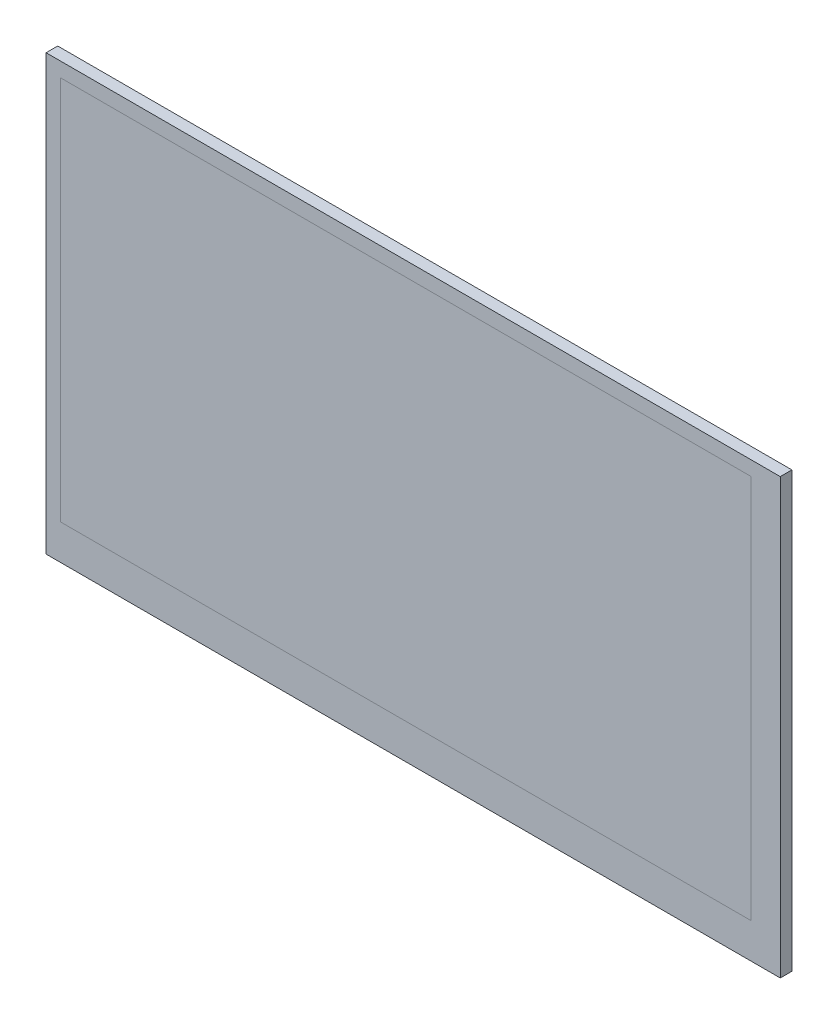
ISO-10303-21;
HEADER;
FILE_DESCRIPTION(('STEP AP214'),'2;1');
FILE_NAME('part.step','',(''),(''),'','','');
FILE_SCHEMA(('AUTOMOTIVE_DESIGN { 1 0 10303 214 1 1 1 1 }'));
ENDSEC;
DATA;
#1=APPLICATION_CONTEXT('core data for automotive mechanical design processes');
#2=APPLICATION_PROTOCOL_DEFINITION('international standard','automotive_design',2000,#1);
#3=PRODUCT_CONTEXT('',#1,'mechanical');
#4=PRODUCT('Part','Part','',(#3));
#5=PRODUCT_RELATED_PRODUCT_CATEGORY('part','',(#4));
#6=PRODUCT_DEFINITION_FORMATION('','',#4);
#7=PRODUCT_DEFINITION_CONTEXT('part definition',#1,'design');
#8=PRODUCT_DEFINITION('design','',#6,#7);
#9=PRODUCT_DEFINITION_SHAPE('','',#8);
#10=(LENGTH_UNIT() NAMED_UNIT(*) SI_UNIT(.MILLI.,.METRE.));
#11=(NAMED_UNIT(*) PLANE_ANGLE_UNIT() SI_UNIT($,.RADIAN.));
#12=(NAMED_UNIT(*) SI_UNIT($,.STERADIAN.) SOLID_ANGLE_UNIT());
#13=UNCERTAINTY_MEASURE_WITH_UNIT(LENGTH_MEASURE(1.E-05),#10,'distance_accuracy_value','');
#14=(GEOMETRIC_REPRESENTATION_CONTEXT(3) GLOBAL_UNCERTAINTY_ASSIGNED_CONTEXT((#13)) GLOBAL_UNIT_ASSIGNED_CONTEXT((#10,
#11,#12)) REPRESENTATION_CONTEXT('',''));
#15=CARTESIAN_POINT('',(0.,0.,0.));
#16=DIRECTION('',(0.,0.,1.));
#17=DIRECTION('',(1.,0.,0.));
#18=AXIS2_PLACEMENT_3D('',#15,#16,#17);
#19=CARTESIAN_POINT('',(0.,0.,1.6));
#20=DIRECTION('',(0.,0.,1.));
#21=DIRECTION('',(1.,0.,0.));
#22=AXIS2_PLACEMENT_3D('',#19,#20,#21);
#23=PLANE('',#22);
#24=DIRECTION('',(0.,-1.,0.));
#25=VECTOR('',#24,1.);
#26=CARTESIAN_POINT('',(-78.8000000000001,45.26,1.6));
#27=LINE('',#26,#25);
#28=CARTESIAN_POINT('',(-78.8000000000001,45.26,1.6));
#29=VERTEX_POINT('',#28);
#30=CARTESIAN_POINT('',(-78.8000000000001,-40.66,1.6));
#31=VERTEX_POINT('',#30);
#32=EDGE_CURVE('E97',#29,#31,#27,.T.);
#33=ORIENTED_EDGE('',*,*,#32,.F.);
#34=DIRECTION('',(-1.,0.,0.));
#35=VECTOR('',#34,1.);
#36=CARTESIAN_POINT('',(-78.8000000000001,45.26,1.6));
#37=LINE('',#36,#35);
#38=CARTESIAN_POINT('',(75.41,45.26,1.6));
#39=VERTEX_POINT('',#38);
#40=EDGE_CURVE('E114',#39,#29,#37,.T.);
#41=ORIENTED_EDGE('',*,*,#40,.F.);
#42=DIRECTION('',(0.,1.,0.));
#43=VECTOR('',#42,1.);
#44=CARTESIAN_POINT('',(75.41,45.26,1.6));
#45=LINE('',#44,#43);
#46=CARTESIAN_POINT('',(75.41,-40.66,1.6));
#47=VERTEX_POINT('',#46);
#48=EDGE_CURVE('E99',#47,#39,#45,.T.);
#49=ORIENTED_EDGE('',*,*,#48,.F.);
#50=DIRECTION('',(1.,0.,0.));
#51=VECTOR('',#50,1.);
#52=CARTESIAN_POINT('',(-78.8000000000001,-40.66,1.6));
#53=LINE('',#52,#51);
#54=EDGE_CURVE('E96',#31,#47,#53,.T.);
#55=ORIENTED_EDGE('',*,*,#54,.F.);
#56=EDGE_LOOP('',(#33,#41,#49,#55));
#57=FACE_BOUND('',#56,.T.);
#58=ADVANCED_FACE('F52',(#57),#23,.F.);
#59=CARTESIAN_POINT('',(-78.8000000000001,45.26,-0.00199999999999983));
#60=DIRECTION('',(0.,1.,0.));
#61=DIRECTION('',(0.,0.,1.));
#62=AXIS2_PLACEMENT_3D('',#59,#60,#61);
#63=PLANE('',#62);
#64=DIRECTION('',(0.,0.,1.));
#65=VECTOR('',#64,1.);
#66=CARTESIAN_POINT('',(75.41,45.26,-0.00199999999999983));
#67=LINE('',#66,#65);
#68=CARTESIAN_POINT('',(75.41,45.26,2.6));
#69=VERTEX_POINT('',#68);
#70=EDGE_CURVE('E80',#39,#69,#67,.T.);
#71=ORIENTED_EDGE('',*,*,#70,.F.);
#72=ORIENTED_EDGE('',*,*,#40,.T.);
#73=DIRECTION('',(0.,0.,1.));
#74=VECTOR('',#73,1.);
#75=CARTESIAN_POINT('',(-78.8000000000001,45.26,-0.00199999999999983));
#76=LINE('',#75,#74);
#77=CARTESIAN_POINT('',(-78.8000000000001,45.26,2.6));
#78=VERTEX_POINT('',#77);
#79=EDGE_CURVE('E60',#29,#78,#76,.T.);
#80=ORIENTED_EDGE('',*,*,#79,.T.);
#81=DIRECTION('',(-1.,0.,0.));
#82=VECTOR('',#81,1.);
#83=CARTESIAN_POINT('',(-78.8000000000001,45.26,2.6));
#84=LINE('',#83,#82);
#85=EDGE_CURVE('E119',#69,#78,#84,.T.);
#86=ORIENTED_EDGE('',*,*,#85,.F.);
#87=EDGE_LOOP('',(#71,#72,#80,#86));
#88=FACE_BOUND('',#87,.T.);
#89=ADVANCED_FACE('F127',(#88),#63,.T.);
#90=CARTESIAN_POINT('',(0.,0.,2.6));
#91=DIRECTION('',(0.,0.,1.));
#92=DIRECTION('',(1.,0.,0.));
#93=AXIS2_PLACEMENT_3D('',#90,#91,#92);
#94=PLANE('',#93);
#95=DIRECTION('',(0.,-1.,0.));
#96=VECTOR('',#95,1.);
#97=CARTESIAN_POINT('',(-78.8000000000001,45.26,2.6));
#98=LINE('',#97,#96);
#99=CARTESIAN_POINT('',(-78.8000000000001,-40.66,2.6));
#100=VERTEX_POINT('',#99);
#101=EDGE_CURVE('E12',#78,#100,#98,.T.);
#102=ORIENTED_EDGE('',*,*,#101,.T.);
#103=DIRECTION('',(1.,0.,0.));
#104=VECTOR('',#103,1.);
#105=CARTESIAN_POINT('',(-78.8000000000001,-40.66,2.6));
#106=LINE('',#105,#104);
#107=CARTESIAN_POINT('',(75.41,-40.66,2.6));
#108=VERTEX_POINT('',#107);
#109=EDGE_CURVE('E65',#100,#108,#106,.T.);
#110=ORIENTED_EDGE('',*,*,#109,.T.);
#111=DIRECTION('',(0.,1.,0.));
#112=VECTOR('',#111,1.);
#113=CARTESIAN_POINT('',(75.41,45.26,2.6));
#114=LINE('',#113,#112);
#115=EDGE_CURVE('E116',#108,#69,#114,.T.);
#116=ORIENTED_EDGE('',*,*,#115,.T.);
#117=ORIENTED_EDGE('',*,*,#85,.T.);
#118=EDGE_LOOP('',(#102,#110,#116,#117));
#119=FACE_BOUND('',#118,.T.);
#120=ADVANCED_FACE('F130',(#119),#94,.T.);
#121=CARTESIAN_POINT('',(75.41,45.26,-0.00199999999999983));
#122=DIRECTION('',(1.,0.,0.));
#123=DIRECTION('',(0.,0.,-1.));
#124=AXIS2_PLACEMENT_3D('',#121,#122,#123);
#125=PLANE('',#124);
#126=DIRECTION('',(0.,0.,1.));
#127=VECTOR('',#126,1.);
#128=CARTESIAN_POINT('',(75.41,-40.66,-0.00199999999999983));
#129=LINE('',#128,#127);
#130=EDGE_CURVE('E115',#47,#108,#129,.T.);
#131=ORIENTED_EDGE('',*,*,#130,.F.);
#132=ORIENTED_EDGE('',*,*,#48,.T.);
#133=ORIENTED_EDGE('',*,*,#70,.T.);
#134=ORIENTED_EDGE('',*,*,#115,.F.);
#135=EDGE_LOOP('',(#131,#132,#133,#134));
#136=FACE_BOUND('',#135,.T.);
#137=ADVANCED_FACE('F122',(#136),#125,.T.);
#138=CARTESIAN_POINT('',(-78.8000000000001,-40.66,-0.00199999999999983));
#139=DIRECTION('',(0.,-1.,0.));
#140=DIRECTION('',(0.,0.,-1.));
#141=AXIS2_PLACEMENT_3D('',#138,#139,#140);
#142=PLANE('',#141);
#143=DIRECTION('',(0.,0.,1.));
#144=VECTOR('',#143,1.);
#145=CARTESIAN_POINT('',(-78.8000000000001,-40.66,-0.00199999999999983));
#146=LINE('',#145,#144);
#147=EDGE_CURVE('E110',#31,#100,#146,.T.);
#148=ORIENTED_EDGE('',*,*,#147,.F.);
#149=ORIENTED_EDGE('',*,*,#54,.T.);
#150=ORIENTED_EDGE('',*,*,#130,.T.);
#151=ORIENTED_EDGE('',*,*,#109,.F.);
#152=EDGE_LOOP('',(#148,#149,#150,#151));
#153=FACE_BOUND('',#152,.T.);
#154=ADVANCED_FACE('F109',(#153),#142,.T.);
#155=CARTESIAN_POINT('',(-78.8000000000001,45.26,-0.00199999999999983));
#156=DIRECTION('',(-1.,0.,0.));
#157=DIRECTION('',(0.,0.,1.));
#158=AXIS2_PLACEMENT_3D('',#155,#156,#157);
#159=PLANE('',#158);
#160=ORIENTED_EDGE('',*,*,#79,.F.);
#161=ORIENTED_EDGE('',*,*,#32,.T.);
#162=ORIENTED_EDGE('',*,*,#147,.T.);
#163=ORIENTED_EDGE('',*,*,#101,.F.);
#164=EDGE_LOOP('',(#160,#161,#162,#163));
#165=FACE_BOUND('',#164,.T.);
#166=ADVANCED_FACE('F54',(#165),#159,.T.);
#167=CLOSED_SHELL('',(#58,#89,#120,#137,#154,#166));
#168=MANIFOLD_SOLID_BREP('B2',#167);
#169=CARTESIAN_POINT('',(82.,48.5,2.6));
#170=DIRECTION('',(-1.,0.,0.));
#171=DIRECTION('',(0.,0.,1.));
#172=AXIS2_PLACEMENT_3D('',#169,#170,#171);
#173=PLANE('',#172);
#174=DIRECTION('',(0.,1.,0.));
#175=VECTOR('',#174,1.);
#176=CARTESIAN_POINT('',(82.,48.5,0.));
#177=LINE('',#176,#175);
#178=CARTESIAN_POINT('',(82.,-48.5,0.));
#179=VERTEX_POINT('',#178);
#180=CARTESIAN_POINT('',(82.,48.5,0.));
#181=VERTEX_POINT('',#180);
#182=EDGE_CURVE('E310',#179,#181,#177,.T.);
#183=ORIENTED_EDGE('',*,*,#182,.T.);
#184=DIRECTION('',(0.,0.,-1.));
#185=VECTOR('',#184,1.);
#186=CARTESIAN_POINT('',(82.,48.5,2.6));
#187=LINE('',#186,#185);
#188=CARTESIAN_POINT('',(82.,48.5,2.6));
#189=VERTEX_POINT('',#188);
#190=EDGE_CURVE('E51',#189,#181,#187,.T.);
#191=ORIENTED_EDGE('',*,*,#190,.F.);
#192=DIRECTION('',(0.,1.,0.));
#193=VECTOR('',#192,1.);
#194=CARTESIAN_POINT('',(82.,48.5,2.6));
#195=LINE('',#194,#193);
#196=CARTESIAN_POINT('',(82.,-48.5,2.6));
#197=VERTEX_POINT('',#196);
#198=EDGE_CURVE('E311',#197,#189,#195,.T.);
#199=ORIENTED_EDGE('',*,*,#198,.F.);
#200=DIRECTION('',(0.,0.,-1.));
#201=VECTOR('',#200,1.);
#202=CARTESIAN_POINT('',(82.,-48.5,2.6));
#203=LINE('',#202,#201);
#204=EDGE_CURVE('E317',#197,#179,#203,.T.);
#205=ORIENTED_EDGE('',*,*,#204,.T.);
#206=EDGE_LOOP('',(#183,#191,#199,#205));
#207=FACE_BOUND('',#206,.T.);
#208=ADVANCED_FACE('F203',(#207),#173,.F.);
#209=CARTESIAN_POINT('',(-82.,48.5,2.6));
#210=DIRECTION('',(0.,-1.,0.));
#211=DIRECTION('',(0.,0.,-1.));
#212=AXIS2_PLACEMENT_3D('',#209,#210,#211);
#213=PLANE('',#212);
#214=DIRECTION('',(-1.,0.,0.));
#215=VECTOR('',#214,1.);
#216=CARTESIAN_POINT('',(-82.,48.5,0.));
#217=LINE('',#216,#215);
#218=CARTESIAN_POINT('',(-82.,48.5,0.));
#219=VERTEX_POINT('',#218);
#220=EDGE_CURVE('E325',#181,#219,#217,.T.);
#221=ORIENTED_EDGE('',*,*,#220,.T.);
#222=DIRECTION('',(0.,0.,-1.));
#223=VECTOR('',#222,1.);
#224=CARTESIAN_POINT('',(-82.,48.5,2.6));
#225=LINE('',#224,#223);
#226=CARTESIAN_POINT('',(-82.,48.5,2.6));
#227=VERTEX_POINT('',#226);
#228=EDGE_CURVE('E208',#227,#219,#225,.T.);
#229=ORIENTED_EDGE('',*,*,#228,.F.);
#230=DIRECTION('',(-1.,0.,0.));
#231=VECTOR('',#230,1.);
#232=CARTESIAN_POINT('',(-82.,48.5,2.6));
#233=LINE('',#232,#231);
#234=EDGE_CURVE('E252',#189,#227,#233,.T.);
#235=ORIENTED_EDGE('',*,*,#234,.F.);
#236=ORIENTED_EDGE('',*,*,#190,.T.);
#237=EDGE_LOOP('',(#221,#229,#235,#236));
#238=FACE_BOUND('',#237,.T.);
#239=ADVANCED_FACE('F352',(#238),#213,.F.);
#240=CARTESIAN_POINT('',(-82.,48.5,2.6));
#241=DIRECTION('',(1.,0.,0.));
#242=DIRECTION('',(0.,1.,0.));
#243=AXIS2_PLACEMENT_3D('',#240,#241,#242);
#244=PLANE('',#243);
#245=DIRECTION('',(0.,-1.,0.));
#246=VECTOR('',#245,1.);
#247=CARTESIAN_POINT('',(-82.,48.5,0.));
#248=LINE('',#247,#246);
#249=CARTESIAN_POINT('',(-82.,-48.5,0.));
#250=VERTEX_POINT('',#249);
#251=EDGE_CURVE('E322',#219,#250,#248,.T.);
#252=ORIENTED_EDGE('',*,*,#251,.T.);
#253=DIRECTION('',(0.,0.,-1.));
#254=VECTOR('',#253,1.);
#255=CARTESIAN_POINT('',(-82.,-48.5,2.6));
#256=LINE('',#255,#254);
#257=CARTESIAN_POINT('',(-82.,-48.5,2.6));
#258=VERTEX_POINT('',#257);
#259=EDGE_CURVE('E327',#258,#250,#256,.T.);
#260=ORIENTED_EDGE('',*,*,#259,.F.);
#261=DIRECTION('',(0.,-1.,0.));
#262=VECTOR('',#261,1.);
#263=CARTESIAN_POINT('',(-82.,48.5,2.6));
#264=LINE('',#263,#262);
#265=EDGE_CURVE('E316',#227,#258,#264,.T.);
#266=ORIENTED_EDGE('',*,*,#265,.F.);
#267=ORIENTED_EDGE('',*,*,#228,.T.);
#268=EDGE_LOOP('',(#252,#260,#266,#267));
#269=FACE_BOUND('',#268,.T.);
#270=ADVANCED_FACE('F334',(#269),#244,.F.);
#271=CARTESIAN_POINT('',(-82.,-48.5,2.6));
#272=DIRECTION('',(0.,1.,0.));
#273=DIRECTION('',(0.,0.,1.));
#274=AXIS2_PLACEMENT_3D('',#271,#272,#273);
#275=PLANE('',#274);
#276=DIRECTION('',(1.,0.,0.));
#277=VECTOR('',#276,1.);
#278=CARTESIAN_POINT('',(-82.,-48.5,0.));
#279=LINE('',#278,#277);
#280=EDGE_CURVE('E243',#250,#179,#279,.T.);
#281=ORIENTED_EDGE('',*,*,#280,.T.);
#282=ORIENTED_EDGE('',*,*,#204,.F.);
#283=DIRECTION('',(1.,0.,0.));
#284=VECTOR('',#283,1.);
#285=CARTESIAN_POINT('',(-82.,-48.5,2.6));
#286=LINE('',#285,#284);
#287=EDGE_CURVE('E221',#258,#197,#286,.T.);
#288=ORIENTED_EDGE('',*,*,#287,.F.);
#289=ORIENTED_EDGE('',*,*,#259,.T.);
#290=EDGE_LOOP('',(#281,#282,#288,#289));
#291=FACE_BOUND('',#290,.T.);
#292=ADVANCED_FACE('F344',(#291),#275,.F.);
#293=CARTESIAN_POINT('',(0.,0.,2.6));
#294=DIRECTION('',(0.,0.,1.));
#295=DIRECTION('',(1.,0.,0.));
#296=AXIS2_PLACEMENT_3D('',#293,#294,#295);
#297=PLANE('',#296);
#298=DIRECTION('',(0.,-1.,0.));
#299=VECTOR('',#298,1.);
#300=CARTESIAN_POINT('',(-78.8000000000001,45.26,2.6));
#301=LINE('',#300,#299);
#302=CARTESIAN_POINT('',(-78.8000000000001,45.26,2.6));
#303=VERTEX_POINT('',#302);
#304=CARTESIAN_POINT('',(-78.8000000000001,-40.66,2.6));
#305=VERTEX_POINT('',#304);
#306=EDGE_CURVE('E214',#303,#305,#301,.T.);
#307=ORIENTED_EDGE('',*,*,#306,.F.);
#308=DIRECTION('',(-1.,0.,0.));
#309=VECTOR('',#308,1.);
#310=CARTESIAN_POINT('',(-78.8000000000001,45.26,2.6));
#311=LINE('',#310,#309);
#312=CARTESIAN_POINT('',(75.41,45.26,2.6));
#313=VERTEX_POINT('',#312);
#314=EDGE_CURVE('E294',#313,#303,#311,.T.);
#315=ORIENTED_EDGE('',*,*,#314,.F.);
#316=DIRECTION('',(0.,1.,0.));
#317=VECTOR('',#316,1.);
#318=CARTESIAN_POINT('',(75.41,45.26,2.6));
#319=LINE('',#318,#317);
#320=CARTESIAN_POINT('',(75.41,-40.66,2.6));
#321=VERTEX_POINT('',#320);
#322=EDGE_CURVE('E300',#321,#313,#319,.T.);
#323=ORIENTED_EDGE('',*,*,#322,.F.);
#324=DIRECTION('',(1.,0.,0.));
#325=VECTOR('',#324,1.);
#326=CARTESIAN_POINT('',(-78.8000000000001,-40.66,2.6));
#327=LINE('',#326,#325);
#328=EDGE_CURVE('E305',#305,#321,#327,.T.);
#329=ORIENTED_EDGE('',*,*,#328,.F.);
#330=EDGE_LOOP('',(#307,#315,#323,#329));
#331=FACE_BOUND('',#330,.T.);
#332=ORIENTED_EDGE('',*,*,#198,.T.);
#333=ORIENTED_EDGE('',*,*,#234,.T.);
#334=ORIENTED_EDGE('',*,*,#265,.T.);
#335=ORIENTED_EDGE('',*,*,#287,.T.);
#336=EDGE_LOOP('',(#332,#333,#334,#335));
#337=FACE_BOUND('',#336,.T.);
#338=ADVANCED_FACE('F345',(#331,#337),#297,.T.);
#339=CARTESIAN_POINT('',(0.,0.,0.));
#340=DIRECTION('',(0.,0.,1.));
#341=DIRECTION('',(1.,0.,0.));
#342=AXIS2_PLACEMENT_3D('',#339,#340,#341);
#343=PLANE('',#342);
#344=ORIENTED_EDGE('',*,*,#182,.F.);
#345=ORIENTED_EDGE('',*,*,#280,.F.);
#346=ORIENTED_EDGE('',*,*,#251,.F.);
#347=ORIENTED_EDGE('',*,*,#220,.F.);
#348=EDGE_LOOP('',(#344,#345,#346,#347));
#349=FACE_BOUND('',#348,.T.);
#350=ADVANCED_FACE('F340',(#349),#343,.F.);
#351=CARTESIAN_POINT('',(-78.8000000000001,45.26,1.6));
#352=DIRECTION('',(-1.,0.,0.));
#353=DIRECTION('',(0.,0.,1.));
#354=AXIS2_PLACEMENT_3D('',#351,#352,#353);
#355=PLANE('',#354);
#356=ORIENTED_EDGE('',*,*,#306,.T.);
#357=DIRECTION('',(0.,0.,1.));
#358=VECTOR('',#357,1.);
#359=CARTESIAN_POINT('',(-78.8000000000001,-40.66,1.6));
#360=LINE('',#359,#358);
#361=CARTESIAN_POINT('',(-78.8000000000001,-40.66,1.6));
#362=VERTEX_POINT('',#361);
#363=EDGE_CURVE('E275',#362,#305,#360,.T.);
#364=ORIENTED_EDGE('',*,*,#363,.F.);
#365=DIRECTION('',(0.,-1.,0.));
#366=VECTOR('',#365,1.);
#367=CARTESIAN_POINT('',(-78.8000000000001,45.26,1.6));
#368=LINE('',#367,#366);
#369=CARTESIAN_POINT('',(-78.8000000000001,45.26,1.6));
#370=VERTEX_POINT('',#369);
#371=EDGE_CURVE('E277',#370,#362,#368,.T.);
#372=ORIENTED_EDGE('',*,*,#371,.F.);
#373=DIRECTION('',(0.,0.,1.));
#374=VECTOR('',#373,1.);
#375=CARTESIAN_POINT('',(-78.8000000000001,45.26,1.6));
#376=LINE('',#375,#374);
#377=EDGE_CURVE('E307',#370,#303,#376,.T.);
#378=ORIENTED_EDGE('',*,*,#377,.T.);
#379=EDGE_LOOP('',(#356,#364,#372,#378));
#380=FACE_BOUND('',#379,.T.);
#381=ADVANCED_FACE('F273',(#380),#355,.F.);
#382=CARTESIAN_POINT('',(-78.8000000000001,45.26,1.6));
#383=DIRECTION('',(0.,1.,0.));
#384=DIRECTION('',(0.,0.,1.));
#385=AXIS2_PLACEMENT_3D('',#382,#383,#384);
#386=PLANE('',#385);
#387=ORIENTED_EDGE('',*,*,#314,.T.);
#388=ORIENTED_EDGE('',*,*,#377,.F.);
#389=DIRECTION('',(-1.,0.,0.));
#390=VECTOR('',#389,1.);
#391=CARTESIAN_POINT('',(-78.8000000000001,45.26,1.6));
#392=LINE('',#391,#390);
#393=CARTESIAN_POINT('',(75.41,45.26,1.6));
#394=VERTEX_POINT('',#393);
#395=EDGE_CURVE('E285',#394,#370,#392,.T.);
#396=ORIENTED_EDGE('',*,*,#395,.F.);
#397=DIRECTION('',(0.,0.,1.));
#398=VECTOR('',#397,1.);
#399=CARTESIAN_POINT('',(75.41,45.26,1.6));
#400=LINE('',#399,#398);
#401=EDGE_CURVE('E309',#394,#313,#400,.T.);
#402=ORIENTED_EDGE('',*,*,#401,.T.);
#403=EDGE_LOOP('',(#387,#388,#396,#402));
#404=FACE_BOUND('',#403,.T.);
#405=ADVANCED_FACE('F400',(#404),#386,.F.);
#406=CARTESIAN_POINT('',(75.41,45.26,1.6));
#407=DIRECTION('',(1.,0.,0.));
#408=DIRECTION('',(0.,1.,0.));
#409=AXIS2_PLACEMENT_3D('',#406,#407,#408);
#410=PLANE('',#409);
#411=ORIENTED_EDGE('',*,*,#322,.T.);
#412=ORIENTED_EDGE('',*,*,#401,.F.);
#413=DIRECTION('',(0.,1.,0.));
#414=VECTOR('',#413,1.);
#415=CARTESIAN_POINT('',(75.41,45.26,1.6));
#416=LINE('',#415,#414);
#417=CARTESIAN_POINT('',(75.41,-40.66,1.6));
#418=VERTEX_POINT('',#417);
#419=EDGE_CURVE('E287',#418,#394,#416,.T.);
#420=ORIENTED_EDGE('',*,*,#419,.F.);
#421=DIRECTION('',(0.,0.,1.));
#422=VECTOR('',#421,1.);
#423=CARTESIAN_POINT('',(75.41,-40.66,1.6));
#424=LINE('',#423,#422);
#425=EDGE_CURVE('E282',#418,#321,#424,.T.);
#426=ORIENTED_EDGE('',*,*,#425,.T.);
#427=EDGE_LOOP('',(#411,#412,#420,#426));
#428=FACE_BOUND('',#427,.T.);
#429=ADVANCED_FACE('F410',(#428),#410,.F.);
#430=CARTESIAN_POINT('',(-78.8000000000001,-40.66,1.6));
#431=DIRECTION('',(0.,-1.,0.));
#432=DIRECTION('',(0.,0.,-1.));
#433=AXIS2_PLACEMENT_3D('',#430,#431,#432);
#434=PLANE('',#433);
#435=ORIENTED_EDGE('',*,*,#328,.T.);
#436=ORIENTED_EDGE('',*,*,#425,.F.);
#437=DIRECTION('',(1.,0.,0.));
#438=VECTOR('',#437,1.);
#439=CARTESIAN_POINT('',(-78.8000000000001,-40.66,1.6));
#440=LINE('',#439,#438);
#441=EDGE_CURVE('E283',#362,#418,#440,.T.);
#442=ORIENTED_EDGE('',*,*,#441,.F.);
#443=ORIENTED_EDGE('',*,*,#363,.T.);
#444=EDGE_LOOP('',(#435,#436,#442,#443));
#445=FACE_BOUND('',#444,.T.);
#446=ADVANCED_FACE('F289',(#445),#434,.F.);
#447=CARTESIAN_POINT('',(0.,0.,1.6));
#448=DIRECTION('',(0.,0.,1.));
#449=DIRECTION('',(1.,0.,0.));
#450=AXIS2_PLACEMENT_3D('',#447,#448,#449);
#451=PLANE('',#450);
#452=ORIENTED_EDGE('',*,*,#371,.T.);
#453=ORIENTED_EDGE('',*,*,#441,.T.);
#454=ORIENTED_EDGE('',*,*,#419,.T.);
#455=ORIENTED_EDGE('',*,*,#395,.T.);
#456=EDGE_LOOP('',(#452,#453,#454,#455));
#457=FACE_BOUND('',#456,.T.);
#458=ADVANCED_FACE('F295',(#457),#451,.T.);
#459=CLOSED_SHELL('',(#208,#239,#270,#292,#338,#350,#381,#405,#429,#446,#458));
#460=MANIFOLD_SOLID_BREP('B6',#459);
#461=ADVANCED_BREP_SHAPE_REPRESENTATION('',(#18,#168,#460),#14);
#462=SHAPE_DEFINITION_REPRESENTATION(#9,#461);
ENDSEC;
END-ISO-10303-21;
